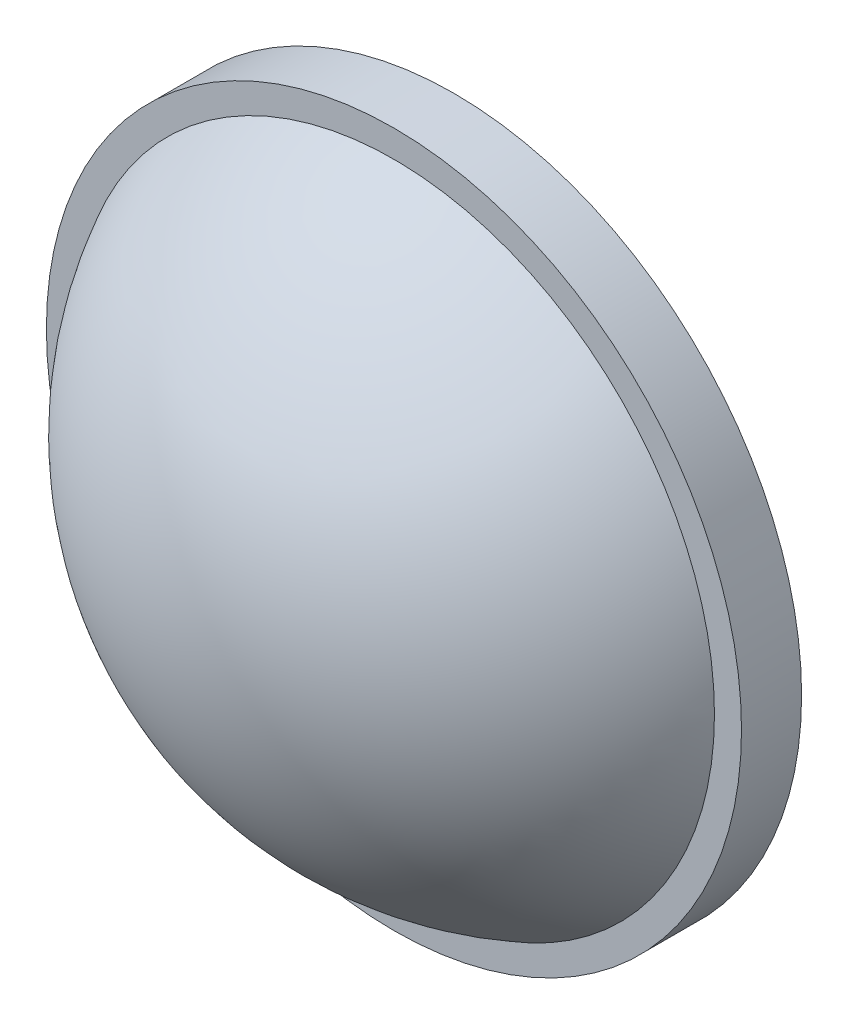
ISO-10303-21;
HEADER;
FILE_DESCRIPTION(('STEP AP214'),'2;1');
FILE_NAME('part.step','',(''),(''),'','','');
FILE_SCHEMA(('AUTOMOTIVE_DESIGN { 1 0 10303 214 1 1 1 1 }'));
ENDSEC;
DATA;
#1=APPLICATION_CONTEXT('core data for automotive mechanical design processes');
#2=APPLICATION_PROTOCOL_DEFINITION('international standard','automotive_design',2000,#1);
#3=PRODUCT_CONTEXT('',#1,'mechanical');
#4=PRODUCT('Part','Part','',(#3));
#5=PRODUCT_RELATED_PRODUCT_CATEGORY('part','',(#4));
#6=PRODUCT_DEFINITION_FORMATION('','',#4);
#7=PRODUCT_DEFINITION_CONTEXT('part definition',#1,'design');
#8=PRODUCT_DEFINITION('design','',#6,#7);
#9=PRODUCT_DEFINITION_SHAPE('','',#8);
#10=(LENGTH_UNIT() NAMED_UNIT(*) SI_UNIT(.MILLI.,.METRE.));
#11=(NAMED_UNIT(*) PLANE_ANGLE_UNIT() SI_UNIT($,.RADIAN.));
#12=(NAMED_UNIT(*) SI_UNIT($,.STERADIAN.) SOLID_ANGLE_UNIT());
#13=UNCERTAINTY_MEASURE_WITH_UNIT(LENGTH_MEASURE(1.E-05),#10,'distance_accuracy_value','');
#14=(GEOMETRIC_REPRESENTATION_CONTEXT(3) GLOBAL_UNCERTAINTY_ASSIGNED_CONTEXT((#13)) GLOBAL_UNIT_ASSIGNED_CONTEXT((#10,
#11,#12)) REPRESENTATION_CONTEXT('',''));
#15=CARTESIAN_POINT('',(0.,0.,0.));
#16=DIRECTION('',(0.,0.,1.));
#17=DIRECTION('',(1.,0.,0.));
#18=AXIS2_PLACEMENT_3D('',#15,#16,#17);
#19=CARTESIAN_POINT('',(0.,0.,3.));
#20=DIRECTION('',(0.,0.,1.));
#21=DIRECTION('',(1.,0.,0.));
#22=AXIS2_PLACEMENT_3D('',#19,#20,#21);
#23=PLANE('',#22);
#24=CARTESIAN_POINT('',(0.,0.,3.));
#25=DIRECTION('',(0.,0.,1.));
#26=DIRECTION('',(1.,0.,0.));
#27=AXIS2_PLACEMENT_3D('',#24,#25,#26);
#28=CIRCLE('',#27,17.35);
#29=CARTESIAN_POINT('',(17.35,0.,3.));
#30=VERTEX_POINT('',#29);
#31=EDGE_CURVE('E41',#30,#30,#28,.T.);
#32=ORIENTED_EDGE('',*,*,#31,.T.);
#33=EDGE_LOOP('',(#32));
#34=FACE_BOUND('',#33,.T.);
#35=CARTESIAN_POINT('',(0.,0.,3.));
#36=DIRECTION('',(0.,0.,1.));
#37=DIRECTION('',(1.,0.,0.));
#38=AXIS2_PLACEMENT_3D('',#35,#36,#37);
#39=CIRCLE('',#38,16.);
#40=CARTESIAN_POINT('',(16.,0.,3.));
#41=VERTEX_POINT('',#40);
#42=EDGE_CURVE('E10',#41,#41,#39,.F.);
#43=ORIENTED_EDGE('',*,*,#42,.T.);
#44=EDGE_LOOP('',(#43));
#45=FACE_BOUND('',#44,.T.);
#46=ADVANCED_FACE('F33',(#34,#45),#23,.T.);
#47=CARTESIAN_POINT('',(0.,0.,3.));
#48=DIRECTION('',(0.,0.,-1.));
#49=DIRECTION('',(-1.,0.,0.));
#50=AXIS2_PLACEMENT_3D('',#47,#48,#49);
#51=CYLINDRICAL_SURFACE('',#50,17.35);
#52=ORIENTED_EDGE('',*,*,#31,.F.);
#53=EDGE_LOOP('',(#52));
#54=FACE_BOUND('',#53,.T.);
#55=CARTESIAN_POINT('',(0.,0.,0.));
#56=DIRECTION('',(0.,0.,1.));
#57=DIRECTION('',(1.,0.,0.));
#58=AXIS2_PLACEMENT_3D('',#55,#56,#57);
#59=CIRCLE('',#58,17.35);
#60=CARTESIAN_POINT('',(17.35,0.,0.));
#61=VERTEX_POINT('',#60);
#62=EDGE_CURVE('E47',#61,#61,#59,.T.);
#63=ORIENTED_EDGE('',*,*,#62,.T.);
#64=EDGE_LOOP('',(#63));
#65=FACE_BOUND('',#64,.T.);
#66=ADVANCED_FACE('F54',(#54,#65),#51,.T.);
#67=CARTESIAN_POINT('',(0.,0.,-5.16122448979591));
#68=DIRECTION('',(0.,0.,1.));
#69=DIRECTION('',(1.,0.,0.));
#70=AXIS2_PLACEMENT_3D('',#67,#68,#69);
#71=SPHERICAL_SURFACE('',#70,17.9612244897959);
#72=ORIENTED_EDGE('',*,*,#42,.F.);
#73=EDGE_LOOP('',(#72));
#74=FACE_BOUND('',#73,.T.);
#75=ADVANCED_FACE('F35',(#74),#71,.T.);
#76=CARTESIAN_POINT('',(0.,0.,0.));
#77=DIRECTION('',(0.,0.,1.));
#78=DIRECTION('',(1.,0.,0.));
#79=AXIS2_PLACEMENT_3D('',#76,#77,#78);
#80=PLANE('',#79);
#81=ORIENTED_EDGE('',*,*,#62,.F.);
#82=EDGE_LOOP('',(#81));
#83=FACE_BOUND('',#82,.T.);
#84=ADVANCED_FACE('F56',(#83),#80,.F.);
#85=CLOSED_SHELL('',(#46,#66,#75,#84));
#86=MANIFOLD_SOLID_BREP('B2',#85);
#87=ADVANCED_BREP_SHAPE_REPRESENTATION('',(#18,#86),#14);
#88=SHAPE_DEFINITION_REPRESENTATION(#9,#87);
ENDSEC;
END-ISO-10303-21;
